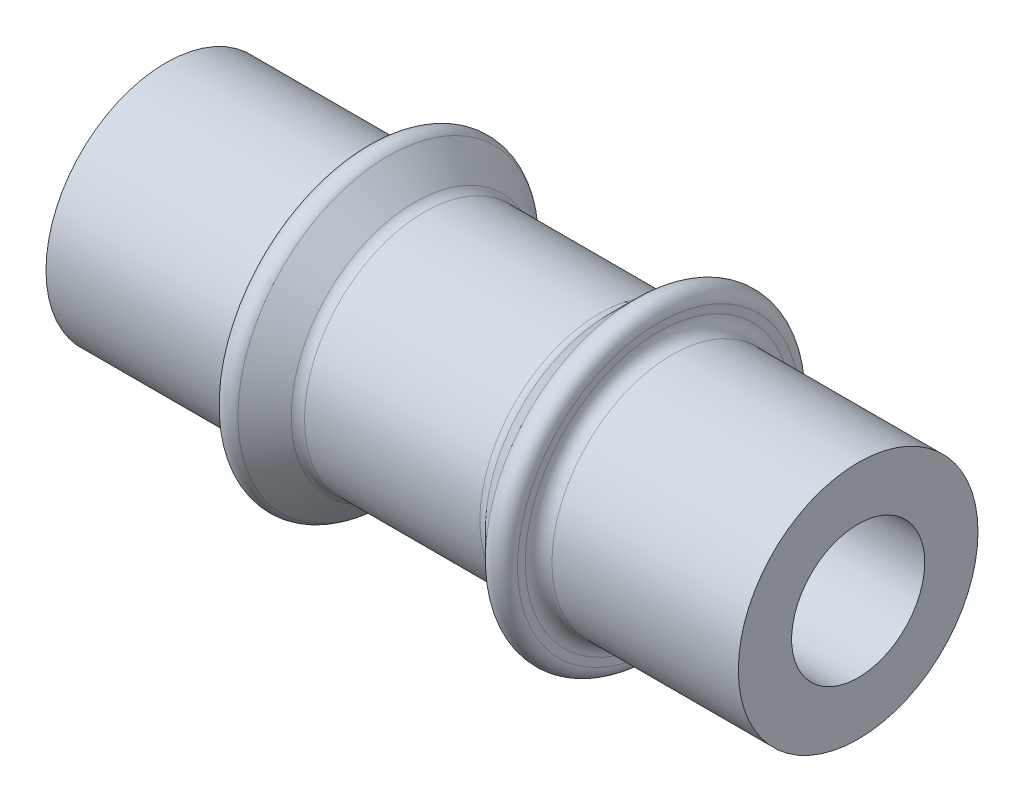
ISO-10303-21;
HEADER;
FILE_DESCRIPTION(('STEP AP214'),'2;1');
FILE_NAME('part.step','',(''),(''),'','','');
FILE_SCHEMA(('AUTOMOTIVE_DESIGN { 1 0 10303 214 1 1 1 1 }'));
ENDSEC;
DATA;
#1=APPLICATION_CONTEXT('core data for automotive mechanical design processes');
#2=APPLICATION_PROTOCOL_DEFINITION('international standard','automotive_design',2000,#1);
#3=PRODUCT_CONTEXT('',#1,'mechanical');
#4=PRODUCT('Part','Part','',(#3));
#5=PRODUCT_RELATED_PRODUCT_CATEGORY('part','',(#4));
#6=PRODUCT_DEFINITION_FORMATION('','',#4);
#7=PRODUCT_DEFINITION_CONTEXT('part definition',#1,'design');
#8=PRODUCT_DEFINITION('design','',#6,#7);
#9=PRODUCT_DEFINITION_SHAPE('','',#8);
#10=(LENGTH_UNIT() NAMED_UNIT(*) SI_UNIT(.MILLI.,.METRE.));
#11=(NAMED_UNIT(*) PLANE_ANGLE_UNIT() SI_UNIT($,.RADIAN.));
#12=(NAMED_UNIT(*) SI_UNIT($,.STERADIAN.) SOLID_ANGLE_UNIT());
#13=UNCERTAINTY_MEASURE_WITH_UNIT(LENGTH_MEASURE(1.E-05),#10,'distance_accuracy_value','');
#14=(GEOMETRIC_REPRESENTATION_CONTEXT(3) GLOBAL_UNCERTAINTY_ASSIGNED_CONTEXT((#13)) GLOBAL_UNIT_ASSIGNED_CONTEXT((#10,
#11,#12)) REPRESENTATION_CONTEXT('',''));
#15=CARTESIAN_POINT('',(0.,0.,0.));
#16=DIRECTION('',(0.,0.,1.));
#17=DIRECTION('',(1.,0.,0.));
#18=AXIS2_PLACEMENT_3D('',#15,#16,#17);
#19=CARTESIAN_POINT('',(-26.,2.5,0.));
#20=DIRECTION('',(-1.,0.,0.));
#21=DIRECTION('',(0.,0.,1.));
#22=AXIS2_PLACEMENT_3D('',#19,#20,#21);
#23=PLANE('',#22);
#24=CARTESIAN_POINT('',(-26.,0.,0.));
#25=DIRECTION('',(1.,0.,0.));
#26=DIRECTION('',(0.,0.,-1.));
#27=AXIS2_PLACEMENT_3D('',#24,#25,#26);
#28=CIRCLE('',#27,2.5);
#29=CARTESIAN_POINT('',(-26.,0.,-2.5));
#30=VERTEX_POINT('',#29);
#31=EDGE_CURVE('E10',#30,#30,#28,.T.);
#32=ORIENTED_EDGE('',*,*,#31,.T.);
#33=EDGE_LOOP('',(#32));
#34=FACE_BOUND('',#33,.T.);
#35=CARTESIAN_POINT('',(-26.,0.,0.));
#36=DIRECTION('',(1.,0.,0.));
#37=DIRECTION('',(0.,0.,-1.));
#38=AXIS2_PLACEMENT_3D('',#35,#36,#37);
#39=CIRCLE('',#38,4.5);
#40=CARTESIAN_POINT('',(-26.,0.,-4.5));
#41=VERTEX_POINT('',#40);
#42=EDGE_CURVE('E84',#41,#41,#39,.T.);
#43=ORIENTED_EDGE('',*,*,#42,.F.);
#44=EDGE_LOOP('',(#43));
#45=FACE_BOUND('',#44,.T.);
#46=ADVANCED_FACE('F32',(#34,#45),#23,.T.);
#47=CARTESIAN_POINT('',(0.,0.,0.));
#48=DIRECTION('',(1.,0.,0.));
#49=DIRECTION('',(0.,0.,-1.));
#50=AXIS2_PLACEMENT_3D('',#47,#48,#49);
#51=CYLINDRICAL_SURFACE('',#50,2.5);
#52=CARTESIAN_POINT('',(0.,0.,0.));
#53=DIRECTION('',(1.,0.,0.));
#54=DIRECTION('',(0.,0.,-1.));
#55=AXIS2_PLACEMENT_3D('',#52,#53,#54);
#56=CIRCLE('',#55,2.5);
#57=CARTESIAN_POINT('',(0.,0.,-2.5));
#58=VERTEX_POINT('',#57);
#59=EDGE_CURVE('E38',#58,#58,#56,.T.);
#60=ORIENTED_EDGE('',*,*,#59,.T.);
#61=EDGE_LOOP('',(#60));
#62=FACE_BOUND('',#61,.T.);
#63=ORIENTED_EDGE('',*,*,#31,.F.);
#64=EDGE_LOOP('',(#63));
#65=FACE_BOUND('',#64,.T.);
#66=ADVANCED_FACE('F92',(#62,#65),#51,.F.);
#67=CARTESIAN_POINT('',(0.,4.5,0.));
#68=DIRECTION('',(1.,0.,0.));
#69=DIRECTION('',(0.,0.,-1.));
#70=AXIS2_PLACEMENT_3D('',#67,#68,#69);
#71=PLANE('',#70);
#72=CARTESIAN_POINT('',(0.,0.,0.));
#73=DIRECTION('',(1.,0.,0.));
#74=DIRECTION('',(0.,0.,-1.));
#75=AXIS2_PLACEMENT_3D('',#72,#73,#74);
#76=CIRCLE('',#75,4.5);
#77=CARTESIAN_POINT('',(0.,0.,-4.5));
#78=VERTEX_POINT('',#77);
#79=EDGE_CURVE('E42',#78,#78,#76,.T.);
#80=ORIENTED_EDGE('',*,*,#79,.T.);
#81=EDGE_LOOP('',(#80));
#82=FACE_BOUND('',#81,.T.);
#83=ORIENTED_EDGE('',*,*,#59,.F.);
#84=EDGE_LOOP('',(#83));
#85=FACE_BOUND('',#84,.T.);
#86=ADVANCED_FACE('F96',(#82,#85),#71,.T.);
#87=CARTESIAN_POINT('',(0.,0.,0.));
#88=DIRECTION('',(1.,0.,0.));
#89=DIRECTION('',(0.,0.,-1.));
#90=AXIS2_PLACEMENT_3D('',#87,#88,#89);
#91=CYLINDRICAL_SURFACE('',#90,4.5);
#92=CARTESIAN_POINT('',(-7.,0.,0.));
#93=DIRECTION('',(1.,0.,0.));
#94=DIRECTION('',(0.,0.,-1.));
#95=AXIS2_PLACEMENT_3D('',#92,#93,#94);
#96=CIRCLE('',#95,4.5);
#97=CARTESIAN_POINT('',(-7.,0.,-4.5));
#98=VERTEX_POINT('',#97);
#99=EDGE_CURVE('E46',#98,#98,#96,.T.);
#100=ORIENTED_EDGE('',*,*,#99,.T.);
#101=EDGE_LOOP('',(#100));
#102=FACE_BOUND('',#101,.T.);
#103=ORIENTED_EDGE('',*,*,#79,.F.);
#104=EDGE_LOOP('',(#103));
#105=FACE_BOUND('',#104,.T.);
#106=ADVANCED_FACE('F100',(#102,#105),#91,.T.);
#107=CARTESIAN_POINT('',(-7.,0.,0.));
#108=DIRECTION('',(1.,0.,0.));
#109=DIRECTION('',(0.,0.,-1.));
#110=AXIS2_PLACEMENT_3D('',#107,#108,#109);
#111=TOROIDAL_SURFACE('',#110,5.,0.5);
#112=CARTESIAN_POINT('',(-7.5,0.,0.));
#113=DIRECTION('',(1.,0.,0.));
#114=DIRECTION('',(0.,0.,-1.));
#115=AXIS2_PLACEMENT_3D('',#112,#113,#114);
#116=CIRCLE('',#115,5.);
#117=CARTESIAN_POINT('',(-7.5,0.,-5.));
#118=VERTEX_POINT('',#117);
#119=EDGE_CURVE('E51',#118,#118,#116,.T.);
#120=ORIENTED_EDGE('',*,*,#119,.T.);
#121=EDGE_LOOP('',(#120));
#122=FACE_BOUND('',#121,.T.);
#123=ORIENTED_EDGE('',*,*,#99,.F.);
#124=EDGE_LOOP('',(#123));
#125=FACE_BOUND('',#124,.T.);
#126=ADVANCED_FACE('F107',(#122,#125),#111,.F.);
#127=CARTESIAN_POINT('',(-7.5,5.29289321881345,0.));
#128=DIRECTION('',(1.,0.,0.));
#129=DIRECTION('',(0.,0.,-1.));
#130=AXIS2_PLACEMENT_3D('',#127,#128,#129);
#131=PLANE('',#130);
#132=CARTESIAN_POINT('',(-7.5,0.,0.));
#133=DIRECTION('',(1.,0.,0.));
#134=DIRECTION('',(0.,0.,-1.));
#135=AXIS2_PLACEMENT_3D('',#132,#133,#134);
#136=CIRCLE('',#135,5.29289321881345);
#137=CARTESIAN_POINT('',(-7.5,0.,-5.29289321881345));
#138=VERTEX_POINT('',#137);
#139=EDGE_CURVE('E54',#138,#138,#136,.T.);
#140=ORIENTED_EDGE('',*,*,#139,.T.);
#141=EDGE_LOOP('',(#140));
#142=FACE_BOUND('',#141,.T.);
#143=ORIENTED_EDGE('',*,*,#119,.F.);
#144=EDGE_LOOP('',(#143));
#145=FACE_BOUND('',#144,.T.);
#146=ADVANCED_FACE('F111',(#142,#145),#131,.T.);
#147=CARTESIAN_POINT('',(-8.,0.,0.));
#148=DIRECTION('',(1.,0.,0.));
#149=DIRECTION('',(0.,0.,-1.));
#150=AXIS2_PLACEMENT_3D('',#147,#148,#149);
#151=TOROIDAL_SURFACE('',#150,5.29289321881345,0.5);
#152=CARTESIAN_POINT('',(-8.35355339059327,0.,0.));
#153=DIRECTION('',(1.,0.,0.));
#154=DIRECTION('',(0.,0.,-1.));
#155=AXIS2_PLACEMENT_3D('',#152,#153,#154);
#156=CIRCLE('',#155,5.64644660940672);
#157=CARTESIAN_POINT('',(-8.35355339059327,0.,-5.64644660940672));
#158=VERTEX_POINT('',#157);
#159=EDGE_CURVE('E57',#158,#158,#156,.T.);
#160=ORIENTED_EDGE('',*,*,#159,.T.);
#161=EDGE_LOOP('',(#160));
#162=FACE_BOUND('',#161,.T.);
#163=ORIENTED_EDGE('',*,*,#139,.F.);
#164=EDGE_LOOP('',(#163));
#165=FACE_BOUND('',#164,.T.);
#166=ADVANCED_FACE('F115',(#162,#165),#151,.T.);
#167=CARTESIAN_POINT('',(-8.35355339059327,0.,0.));
#168=DIRECTION('',(1.,0.,0.));
#169=DIRECTION('',(0.,0.,-1.));
#170=AXIS2_PLACEMENT_3D('',#167,#168,#169);
#171=CONICAL_SURFACE('',#170,5.64644660940672,0.785398163397446);
#172=CARTESIAN_POINT('',(-9.35355339059327,0.,0.));
#173=DIRECTION('',(1.,0.,0.));
#174=DIRECTION('',(0.,0.,-1.));
#175=AXIS2_PLACEMENT_3D('',#172,#173,#174);
#176=CIRCLE('',#175,4.64644660940673);
#177=CARTESIAN_POINT('',(-9.35355339059327,0.,-4.64644660940673));
#178=VERTEX_POINT('',#177);
#179=EDGE_CURVE('E60',#178,#178,#176,.T.);
#180=ORIENTED_EDGE('',*,*,#179,.T.);
#181=EDGE_LOOP('',(#180));
#182=FACE_BOUND('',#181,.T.);
#183=ORIENTED_EDGE('',*,*,#159,.F.);
#184=EDGE_LOOP('',(#183));
#185=FACE_BOUND('',#184,.T.);
#186=ADVANCED_FACE('F119',(#182,#185),#171,.T.);
#187=CARTESIAN_POINT('',(-9.70710678118655,0.,0.));
#188=DIRECTION('',(1.,0.,0.));
#189=DIRECTION('',(0.,0.,-1.));
#190=AXIS2_PLACEMENT_3D('',#187,#188,#189);
#191=TOROIDAL_SURFACE('',#190,5.,0.5);
#192=CARTESIAN_POINT('',(-9.70710678118655,0.,0.));
#193=DIRECTION('',(1.,0.,0.));
#194=DIRECTION('',(0.,0.,-1.));
#195=AXIS2_PLACEMENT_3D('',#192,#193,#194);
#196=CIRCLE('',#195,4.5);
#197=CARTESIAN_POINT('',(-9.70710678118655,0.,-4.5));
#198=VERTEX_POINT('',#197);
#199=EDGE_CURVE('E63',#198,#198,#196,.T.);
#200=ORIENTED_EDGE('',*,*,#199,.T.);
#201=EDGE_LOOP('',(#200));
#202=FACE_BOUND('',#201,.T.);
#203=ORIENTED_EDGE('',*,*,#179,.F.);
#204=EDGE_LOOP('',(#203));
#205=FACE_BOUND('',#204,.T.);
#206=ADVANCED_FACE('F123',(#202,#205),#191,.F.);
#207=CARTESIAN_POINT('',(0.,0.,0.));
#208=DIRECTION('',(1.,0.,0.));
#209=DIRECTION('',(0.,0.,-1.));
#210=AXIS2_PLACEMENT_3D('',#207,#208,#209);
#211=CYLINDRICAL_SURFACE('',#210,4.5);
#212=CARTESIAN_POINT('',(-16.2928932188135,0.,0.));
#213=DIRECTION('',(1.,0.,0.));
#214=DIRECTION('',(0.,0.,-1.));
#215=AXIS2_PLACEMENT_3D('',#212,#213,#214);
#216=CIRCLE('',#215,4.5);
#217=CARTESIAN_POINT('',(-16.2928932188135,0.,-4.5));
#218=VERTEX_POINT('',#217);
#219=EDGE_CURVE('E66',#218,#218,#216,.T.);
#220=ORIENTED_EDGE('',*,*,#219,.T.);
#221=EDGE_LOOP('',(#220));
#222=FACE_BOUND('',#221,.T.);
#223=ORIENTED_EDGE('',*,*,#199,.F.);
#224=EDGE_LOOP('',(#223));
#225=FACE_BOUND('',#224,.T.);
#226=ADVANCED_FACE('F127',(#222,#225),#211,.T.);
#227=CARTESIAN_POINT('',(-16.2928932188135,0.,0.));
#228=DIRECTION('',(1.,0.,0.));
#229=DIRECTION('',(0.,0.,-1.));
#230=AXIS2_PLACEMENT_3D('',#227,#228,#229);
#231=TOROIDAL_SURFACE('',#230,5.,0.5);
#232=CARTESIAN_POINT('',(-16.6464466094067,0.,0.));
#233=DIRECTION('',(1.,0.,0.));
#234=DIRECTION('',(0.,0.,-1.));
#235=AXIS2_PLACEMENT_3D('',#232,#233,#234);
#236=CIRCLE('',#235,4.64644660940673);
#237=CARTESIAN_POINT('',(-16.6464466094067,0.,-4.64644660940673));
#238=VERTEX_POINT('',#237);
#239=EDGE_CURVE('E69',#238,#238,#236,.T.);
#240=ORIENTED_EDGE('',*,*,#239,.T.);
#241=EDGE_LOOP('',(#240));
#242=FACE_BOUND('',#241,.T.);
#243=ORIENTED_EDGE('',*,*,#219,.F.);
#244=EDGE_LOOP('',(#243));
#245=FACE_BOUND('',#244,.T.);
#246=ADVANCED_FACE('F131',(#242,#245),#231,.F.);
#247=CARTESIAN_POINT('',(-16.6464466094067,0.,0.));
#248=DIRECTION('',(-1.,0.,0.));
#249=DIRECTION('',(0.,0.,1.));
#250=AXIS2_PLACEMENT_3D('',#247,#248,#249);
#251=CONICAL_SURFACE('',#250,4.64644660940673,0.785398163397448);
#252=CARTESIAN_POINT('',(-17.6464466094067,0.,0.));
#253=DIRECTION('',(1.,0.,0.));
#254=DIRECTION('',(0.,0.,-1.));
#255=AXIS2_PLACEMENT_3D('',#252,#253,#254);
#256=CIRCLE('',#255,5.64644660940672);
#257=CARTESIAN_POINT('',(-17.6464466094067,0.,-5.64644660940672));
#258=VERTEX_POINT('',#257);
#259=EDGE_CURVE('E72',#258,#258,#256,.T.);
#260=ORIENTED_EDGE('',*,*,#259,.T.);
#261=EDGE_LOOP('',(#260));
#262=FACE_BOUND('',#261,.T.);
#263=ORIENTED_EDGE('',*,*,#239,.F.);
#264=EDGE_LOOP('',(#263));
#265=FACE_BOUND('',#264,.T.);
#266=ADVANCED_FACE('F135',(#262,#265),#251,.T.);
#267=CARTESIAN_POINT('',(-18.,0.,0.));
#268=DIRECTION('',(1.,0.,0.));
#269=DIRECTION('',(0.,0.,-1.));
#270=AXIS2_PLACEMENT_3D('',#267,#268,#269);
#271=TOROIDAL_SURFACE('',#270,5.29289321881345,0.500000000000001);
#272=CARTESIAN_POINT('',(-18.5,0.,0.));
#273=DIRECTION('',(1.,0.,0.));
#274=DIRECTION('',(0.,0.,-1.));
#275=AXIS2_PLACEMENT_3D('',#272,#273,#274);
#276=CIRCLE('',#275,5.29289321881345);
#277=CARTESIAN_POINT('',(-18.5,0.,-5.29289321881345));
#278=VERTEX_POINT('',#277);
#279=EDGE_CURVE('E75',#278,#278,#276,.T.);
#280=ORIENTED_EDGE('',*,*,#279,.T.);
#281=EDGE_LOOP('',(#280));
#282=FACE_BOUND('',#281,.T.);
#283=ORIENTED_EDGE('',*,*,#259,.F.);
#284=EDGE_LOOP('',(#283));
#285=FACE_BOUND('',#284,.T.);
#286=ADVANCED_FACE('F139',(#282,#285),#271,.T.);
#287=CARTESIAN_POINT('',(-18.5,5.,0.));
#288=DIRECTION('',(-1.,0.,0.));
#289=DIRECTION('',(0.,0.,1.));
#290=AXIS2_PLACEMENT_3D('',#287,#288,#289);
#291=PLANE('',#290);
#292=CARTESIAN_POINT('',(-18.5,0.,0.));
#293=DIRECTION('',(1.,0.,0.));
#294=DIRECTION('',(0.,0.,-1.));
#295=AXIS2_PLACEMENT_3D('',#292,#293,#294);
#296=CIRCLE('',#295,5.);
#297=CARTESIAN_POINT('',(-18.5,0.,-5.));
#298=VERTEX_POINT('',#297);
#299=EDGE_CURVE('E78',#298,#298,#296,.T.);
#300=ORIENTED_EDGE('',*,*,#299,.T.);
#301=EDGE_LOOP('',(#300));
#302=FACE_BOUND('',#301,.T.);
#303=ORIENTED_EDGE('',*,*,#279,.F.);
#304=EDGE_LOOP('',(#303));
#305=FACE_BOUND('',#304,.T.);
#306=ADVANCED_FACE('F143',(#302,#305),#291,.T.);
#307=CARTESIAN_POINT('',(-19.,0.,0.));
#308=DIRECTION('',(1.,0.,0.));
#309=DIRECTION('',(0.,0.,-1.));
#310=AXIS2_PLACEMENT_3D('',#307,#308,#309);
#311=TOROIDAL_SURFACE('',#310,5.,0.5);
#312=CARTESIAN_POINT('',(-19.,0.,0.));
#313=DIRECTION('',(1.,0.,0.));
#314=DIRECTION('',(0.,0.,-1.));
#315=AXIS2_PLACEMENT_3D('',#312,#313,#314);
#316=CIRCLE('',#315,4.5);
#317=CARTESIAN_POINT('',(-19.,0.,-4.5));
#318=VERTEX_POINT('',#317);
#319=EDGE_CURVE('E81',#318,#318,#316,.T.);
#320=ORIENTED_EDGE('',*,*,#319,.T.);
#321=EDGE_LOOP('',(#320));
#322=FACE_BOUND('',#321,.T.);
#323=ORIENTED_EDGE('',*,*,#299,.F.);
#324=EDGE_LOOP('',(#323));
#325=FACE_BOUND('',#324,.T.);
#326=ADVANCED_FACE('F147',(#322,#325),#311,.F.);
#327=CARTESIAN_POINT('',(0.,0.,0.));
#328=DIRECTION('',(1.,0.,0.));
#329=DIRECTION('',(0.,0.,-1.));
#330=AXIS2_PLACEMENT_3D('',#327,#328,#329);
#331=CYLINDRICAL_SURFACE('',#330,4.5);
#332=ORIENTED_EDGE('',*,*,#42,.T.);
#333=EDGE_LOOP('',(#332));
#334=FACE_BOUND('',#333,.T.);
#335=ORIENTED_EDGE('',*,*,#319,.F.);
#336=EDGE_LOOP('',(#335));
#337=FACE_BOUND('',#336,.T.);
#338=ADVANCED_FACE('F88',(#334,#337),#331,.T.);
#339=CLOSED_SHELL('',(#46,#66,#86,#106,#126,#146,#166,#186,#206,#226,#246,#266,#286,#306,#326,#338));
#340=MANIFOLD_SOLID_BREP('B2',#339);
#341=ADVANCED_BREP_SHAPE_REPRESENTATION('',(#18,#340),#14);
#342=SHAPE_DEFINITION_REPRESENTATION(#9,#341);
ENDSEC;
END-ISO-10303-21;
